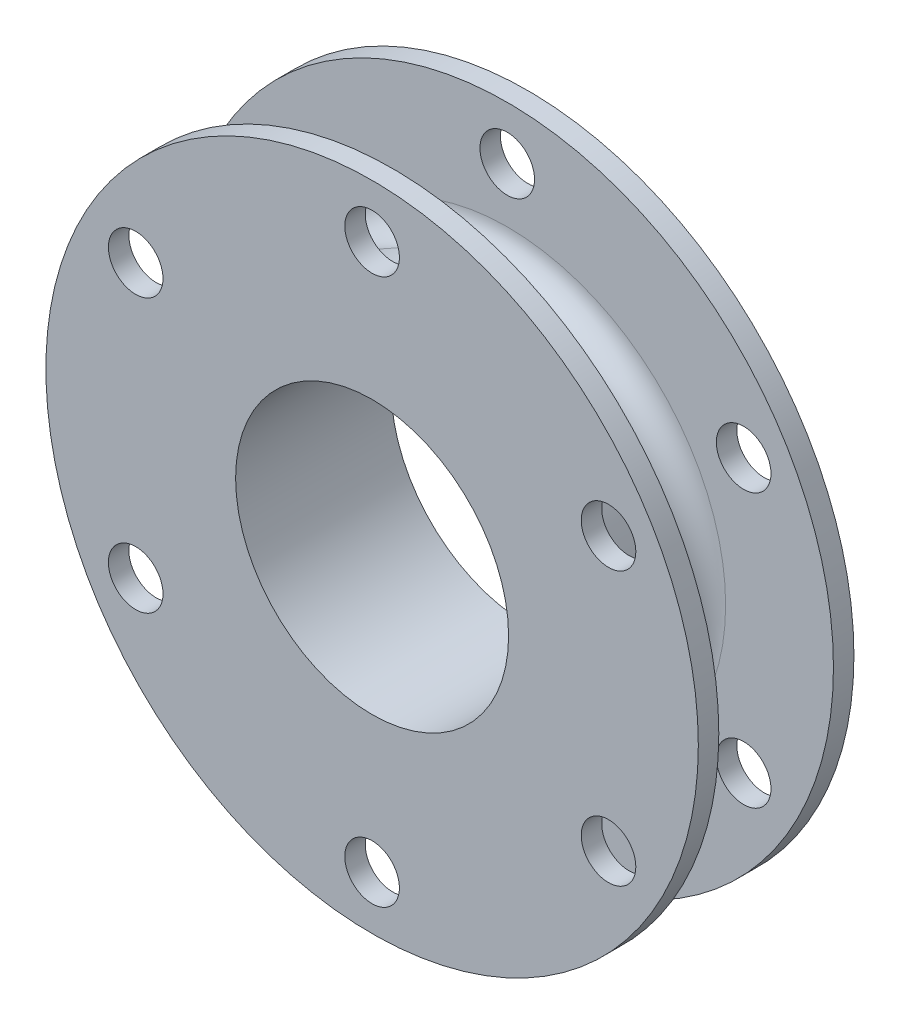
ISO-10303-21;
HEADER;
FILE_DESCRIPTION(('STEP AP214'),'2;1');
FILE_NAME('part.step','',(''),(''),'','','');
FILE_SCHEMA(('AUTOMOTIVE_DESIGN { 1 0 10303 214 1 1 1 1 }'));
ENDSEC;
DATA;
#1=APPLICATION_CONTEXT('core data for automotive mechanical design processes');
#2=APPLICATION_PROTOCOL_DEFINITION('international standard','automotive_design',2000,#1);
#3=PRODUCT_CONTEXT('',#1,'mechanical');
#4=PRODUCT('Part','Part','',(#3));
#5=PRODUCT_RELATED_PRODUCT_CATEGORY('part','',(#4));
#6=PRODUCT_DEFINITION_FORMATION('','',#4);
#7=PRODUCT_DEFINITION_CONTEXT('part definition',#1,'design');
#8=PRODUCT_DEFINITION('design','',#6,#7);
#9=PRODUCT_DEFINITION_SHAPE('','',#8);
#10=(LENGTH_UNIT() NAMED_UNIT(*) SI_UNIT(.MILLI.,.METRE.));
#11=(NAMED_UNIT(*) PLANE_ANGLE_UNIT() SI_UNIT($,.RADIAN.));
#12=(NAMED_UNIT(*) SI_UNIT($,.STERADIAN.) SOLID_ANGLE_UNIT());
#13=UNCERTAINTY_MEASURE_WITH_UNIT(LENGTH_MEASURE(1.E-05),#10,'distance_accuracy_value','');
#14=(GEOMETRIC_REPRESENTATION_CONTEXT(3) GLOBAL_UNCERTAINTY_ASSIGNED_CONTEXT((#13)) GLOBAL_UNIT_ASSIGNED_CONTEXT((#10,
#11,#12)) REPRESENTATION_CONTEXT('',''));
#15=CARTESIAN_POINT('',(0.,0.,0.));
#16=DIRECTION('',(0.,0.,1.));
#17=DIRECTION('',(1.,0.,0.));
#18=AXIS2_PLACEMENT_3D('',#15,#16,#17);
#19=CARTESIAN_POINT('',(0.,0.,50.9979797464467));
#20=DIRECTION('',(0.,0.,-1.));
#21=DIRECTION('',(-1.,0.,0.));
#22=AXIS2_PLACEMENT_3D('',#19,#20,#21);
#23=CYLINDRICAL_SURFACE('',#22,14.);
#24=CARTESIAN_POINT('',(0.,0.,7.9));
#25=DIRECTION('',(0.,0.,1.));
#26=DIRECTION('',(1.,0.,0.));
#27=AXIS2_PLACEMENT_3D('',#24,#25,#26);
#28=CIRCLE('',#27,14.);
#29=CARTESIAN_POINT('',(14.,0.,7.9));
#30=VERTEX_POINT('',#29);
#31=EDGE_CURVE('E49',#30,#30,#28,.F.);
#32=ORIENTED_EDGE('',*,*,#31,.T.);
#33=EDGE_LOOP('',(#32));
#34=FACE_BOUND('',#33,.T.);
#35=CARTESIAN_POINT('',(0.,0.,3.5));
#36=DIRECTION('',(0.,0.,1.));
#37=DIRECTION('',(1.,0.,0.));
#38=AXIS2_PLACEMENT_3D('',#35,#36,#37);
#39=CIRCLE('',#38,14.);
#40=CARTESIAN_POINT('',(14.,0.,3.5));
#41=VERTEX_POINT('',#40);
#42=EDGE_CURVE('E54',#41,#41,#39,.T.);
#43=ORIENTED_EDGE('',*,*,#42,.T.);
#44=EDGE_LOOP('',(#43));
#45=FACE_BOUND('',#44,.T.);
#46=ADVANCED_FACE('F41',(#34,#45),#23,.T.);
#47=CARTESIAN_POINT('',(0.,0.,1.5));
#48=DIRECTION('',(0.,0.,1.));
#49=DIRECTION('',(1.,0.,0.));
#50=AXIS2_PLACEMENT_3D('',#47,#48,#49);
#51=PLANE('',#50);
#52=CARTESIAN_POINT('',(0.,0.,1.5));
#53=DIRECTION('',(0.,0.,1.));
#54=DIRECTION('',(1.,0.,0.));
#55=AXIS2_PLACEMENT_3D('',#52,#53,#54);
#56=CIRCLE('',#55,16.);
#57=CARTESIAN_POINT('',(16.,0.,1.5));
#58=VERTEX_POINT('',#57);
#59=EDGE_CURVE('E10',#58,#58,#56,.F.);
#60=ORIENTED_EDGE('',*,*,#59,.T.);
#61=EDGE_LOOP('',(#60));
#62=FACE_BOUND('',#61,.T.);
#63=CARTESIAN_POINT('',(17.3205080756852,9.99999999999888,1.5));
#64=DIRECTION('',(0.,0.,1.));
#65=DIRECTION('',(1.,0.,0.));
#66=AXIS2_PLACEMENT_3D('',#63,#64,#65);
#67=CIRCLE('',#66,2.00000000000001);
#68=CARTESIAN_POINT('',(19.3205080756852,9.99999999999888,1.5));
#69=VERTEX_POINT('',#68);
#70=EDGE_CURVE('E102',#69,#69,#67,.T.);
#71=ORIENTED_EDGE('',*,*,#70,.F.);
#72=EDGE_LOOP('',(#71));
#73=FACE_BOUND('',#72,.T.);
#74=CARTESIAN_POINT('',(-17.3205080756924,9.99999999999049,1.5));
#75=DIRECTION('',(0.,0.,1.));
#76=DIRECTION('',(1.,0.,0.));
#77=AXIS2_PLACEMENT_3D('',#74,#75,#76);
#78=CIRCLE('',#77,2.);
#79=CARTESIAN_POINT('',(-15.3205080756924,9.99999999999049,1.5));
#80=VERTEX_POINT('',#79);
#81=EDGE_CURVE('E86',#80,#80,#78,.T.);
#82=ORIENTED_EDGE('',*,*,#81,.F.);
#83=EDGE_LOOP('',(#82));
#84=FACE_BOUND('',#83,.T.);
#85=CARTESIAN_POINT('',(2.32298736313842E-12,-20.,1.5));
#86=DIRECTION('',(0.,0.,1.));
#87=DIRECTION('',(1.,0.,0.));
#88=AXIS2_PLACEMENT_3D('',#85,#86,#87);
#89=CIRCLE('',#88,2.);
#90=CARTESIAN_POINT('',(2.00000000000232,-20.,1.5));
#91=VERTEX_POINT('',#90);
#92=EDGE_CURVE('E70',#91,#91,#89,.T.);
#93=ORIENTED_EDGE('',*,*,#92,.F.);
#94=EDGE_LOOP('',(#93));
#95=FACE_BOUND('',#94,.T.);
#96=CARTESIAN_POINT('',(0.,0.,1.5));
#97=DIRECTION('',(0.,0.,1.));
#98=DIRECTION('',(1.,0.,0.));
#99=AXIS2_PLACEMENT_3D('',#96,#97,#98);
#100=CIRCLE('',#99,23.9);
#101=CARTESIAN_POINT('',(23.9,0.,1.5));
#102=VERTEX_POINT('',#101);
#103=EDGE_CURVE('E65',#102,#102,#100,.T.);
#104=ORIENTED_EDGE('',*,*,#103,.T.);
#105=EDGE_LOOP('',(#104));
#106=FACE_BOUND('',#105,.T.);
#107=CARTESIAN_POINT('',(-17.3205080756875,-10.0000000000095,1.5));
#108=DIRECTION('',(0.,0.,1.));
#109=DIRECTION('',(1.,0.,0.));
#110=AXIS2_PLACEMENT_3D('',#107,#108,#109);
#111=CIRCLE('',#110,2.00000000000001);
#112=CARTESIAN_POINT('',(-15.3205080756875,-10.0000000000095,1.5));
#113=VERTEX_POINT('',#112);
#114=EDGE_CURVE('E78',#113,#113,#111,.T.);
#115=ORIENTED_EDGE('',*,*,#114,.F.);
#116=EDGE_LOOP('',(#115));
#117=FACE_BOUND('',#116,.T.);
#118=CARTESIAN_POINT('',(17.32050807569,-10.0000000000011,1.5));
#119=DIRECTION('',(0.,0.,1.));
#120=DIRECTION('',(1.,0.,0.));
#121=AXIS2_PLACEMENT_3D('',#118,#119,#120);
#122=CIRCLE('',#121,2.);
#123=CARTESIAN_POINT('',(19.32050807569,-10.0000000000011,1.5));
#124=VERTEX_POINT('',#123);
#125=EDGE_CURVE('E94',#124,#124,#122,.T.);
#126=ORIENTED_EDGE('',*,*,#125,.F.);
#127=EDGE_LOOP('',(#126));
#128=FACE_BOUND('',#127,.T.);
#129=CARTESIAN_POINT('',(0.,20.,1.5));
#130=DIRECTION('',(0.,0.,1.));
#131=DIRECTION('',(1.,0.,0.));
#132=AXIS2_PLACEMENT_3D('',#129,#130,#131);
#133=CIRCLE('',#132,2.);
#134=CARTESIAN_POINT('',(2.,20.,1.5));
#135=VERTEX_POINT('',#134);
#136=EDGE_CURVE('E110',#135,#135,#133,.T.);
#137=ORIENTED_EDGE('',*,*,#136,.F.);
#138=EDGE_LOOP('',(#137));
#139=FACE_BOUND('',#138,.T.);
#140=ADVANCED_FACE('F226',(#62,#73,#84,#95,#106,#117,#128,#139),#51,.T.);
#141=CARTESIAN_POINT('',(0.,0.,0.));
#142=DIRECTION('',(0.,0.,1.));
#143=DIRECTION('',(1.,0.,0.));
#144=AXIS2_PLACEMENT_3D('',#141,#142,#143);
#145=PLANE('',#144);
#146=CARTESIAN_POINT('',(0.,0.,0.));
#147=DIRECTION('',(0.,0.,1.));
#148=DIRECTION('',(1.,0.,0.));
#149=AXIS2_PLACEMENT_3D('',#146,#147,#148);
#150=CIRCLE('',#149,23.9);
#151=CARTESIAN_POINT('',(23.9,0.,0.));
#152=VERTEX_POINT('',#151);
#153=EDGE_CURVE('E66',#152,#152,#150,.T.);
#154=ORIENTED_EDGE('',*,*,#153,.F.);
#155=EDGE_LOOP('',(#154));
#156=FACE_BOUND('',#155,.T.);
#157=CARTESIAN_POINT('',(2.32298736313842E-12,-20.,0.));
#158=DIRECTION('',(0.,0.,1.));
#159=DIRECTION('',(1.,0.,0.));
#160=AXIS2_PLACEMENT_3D('',#157,#158,#159);
#161=CIRCLE('',#160,2.);
#162=CARTESIAN_POINT('',(2.00000000000232,-20.,0.));
#163=VERTEX_POINT('',#162);
#164=EDGE_CURVE('E74',#163,#163,#161,.T.);
#165=ORIENTED_EDGE('',*,*,#164,.T.);
#166=EDGE_LOOP('',(#165));
#167=FACE_BOUND('',#166,.T.);
#168=CARTESIAN_POINT('',(-17.3205080756875,-10.0000000000095,0.));
#169=DIRECTION('',(0.,0.,1.));
#170=DIRECTION('',(1.,0.,0.));
#171=AXIS2_PLACEMENT_3D('',#168,#169,#170);
#172=CIRCLE('',#171,2.00000000000001);
#173=CARTESIAN_POINT('',(-15.3205080756875,-10.0000000000095,0.));
#174=VERTEX_POINT('',#173);
#175=EDGE_CURVE('E82',#174,#174,#172,.T.);
#176=ORIENTED_EDGE('',*,*,#175,.T.);
#177=EDGE_LOOP('',(#176));
#178=FACE_BOUND('',#177,.T.);
#179=CARTESIAN_POINT('',(-17.3205080756924,9.99999999999049,0.));
#180=DIRECTION('',(0.,0.,1.));
#181=DIRECTION('',(1.,0.,0.));
#182=AXIS2_PLACEMENT_3D('',#179,#180,#181);
#183=CIRCLE('',#182,2.);
#184=CARTESIAN_POINT('',(-15.3205080756924,9.99999999999049,0.));
#185=VERTEX_POINT('',#184);
#186=EDGE_CURVE('E90',#185,#185,#183,.T.);
#187=ORIENTED_EDGE('',*,*,#186,.T.);
#188=EDGE_LOOP('',(#187));
#189=FACE_BOUND('',#188,.T.);
#190=CARTESIAN_POINT('',(17.32050807569,-10.0000000000011,0.));
#191=DIRECTION('',(0.,0.,1.));
#192=DIRECTION('',(1.,0.,0.));
#193=AXIS2_PLACEMENT_3D('',#190,#191,#192);
#194=CIRCLE('',#193,2.);
#195=CARTESIAN_POINT('',(19.32050807569,-10.0000000000011,0.));
#196=VERTEX_POINT('',#195);
#197=EDGE_CURVE('E98',#196,#196,#194,.T.);
#198=ORIENTED_EDGE('',*,*,#197,.T.);
#199=EDGE_LOOP('',(#198));
#200=FACE_BOUND('',#199,.T.);
#201=CARTESIAN_POINT('',(17.3205080756852,9.99999999999888,0.));
#202=DIRECTION('',(0.,0.,1.));
#203=DIRECTION('',(1.,0.,0.));
#204=AXIS2_PLACEMENT_3D('',#201,#202,#203);
#205=CIRCLE('',#204,2.00000000000001);
#206=CARTESIAN_POINT('',(19.3205080756852,9.99999999999888,0.));
#207=VERTEX_POINT('',#206);
#208=EDGE_CURVE('E106',#207,#207,#205,.T.);
#209=ORIENTED_EDGE('',*,*,#208,.T.);
#210=EDGE_LOOP('',(#209));
#211=FACE_BOUND('',#210,.T.);
#212=CARTESIAN_POINT('',(0.,20.,0.));
#213=DIRECTION('',(0.,0.,1.));
#214=DIRECTION('',(1.,0.,0.));
#215=AXIS2_PLACEMENT_3D('',#212,#213,#214);
#216=CIRCLE('',#215,2.);
#217=CARTESIAN_POINT('',(2.,20.,0.));
#218=VERTEX_POINT('',#217);
#219=EDGE_CURVE('E114',#218,#218,#216,.T.);
#220=ORIENTED_EDGE('',*,*,#219,.T.);
#221=EDGE_LOOP('',(#220));
#222=FACE_BOUND('',#221,.T.);
#223=CARTESIAN_POINT('',(0.,0.,0.));
#224=DIRECTION('',(0.,0.,1.));
#225=DIRECTION('',(1.,0.,0.));
#226=AXIS2_PLACEMENT_3D('',#223,#224,#225);
#227=CIRCLE('',#226,10.);
#228=CARTESIAN_POINT('',(10.,0.,0.));
#229=VERTEX_POINT('',#228);
#230=EDGE_CURVE('E118',#229,#229,#227,.T.);
#231=ORIENTED_EDGE('',*,*,#230,.T.);
#232=EDGE_LOOP('',(#231));
#233=FACE_BOUND('',#232,.T.);
#234=ADVANCED_FACE('F231',(#156,#167,#178,#189,#200,#211,#222,#233),#145,.F.);
#235=CARTESIAN_POINT('',(0.,0.,1.5));
#236=DIRECTION('',(0.,0.,-1.));
#237=DIRECTION('',(-1.,0.,0.));
#238=AXIS2_PLACEMENT_3D('',#235,#236,#237);
#239=CYLINDRICAL_SURFACE('',#238,23.9);
#240=ORIENTED_EDGE('',*,*,#103,.F.);
#241=EDGE_LOOP('',(#240));
#242=FACE_BOUND('',#241,.T.);
#243=ORIENTED_EDGE('',*,*,#153,.T.);
#244=EDGE_LOOP('',(#243));
#245=FACE_BOUND('',#244,.T.);
#246=ADVANCED_FACE('F260',(#242,#245),#239,.T.);
#247=CARTESIAN_POINT('',(2.32298736313842E-12,-20.,1.5));
#248=DIRECTION('',(0.,0.,-1.));
#249=DIRECTION('',(-1.,0.,0.));
#250=AXIS2_PLACEMENT_3D('',#247,#248,#249);
#251=CYLINDRICAL_SURFACE('',#250,2.);
#252=ORIENTED_EDGE('',*,*,#92,.T.);
#253=EDGE_LOOP('',(#252));
#254=FACE_BOUND('',#253,.T.);
#255=ORIENTED_EDGE('',*,*,#164,.F.);
#256=EDGE_LOOP('',(#255));
#257=FACE_BOUND('',#256,.T.);
#258=ADVANCED_FACE('F257',(#254,#257),#251,.F.);
#259=CARTESIAN_POINT('',(-17.3205080756875,-10.0000000000095,1.5));
#260=DIRECTION('',(0.,0.,-1.));
#261=DIRECTION('',(-1.,0.,0.));
#262=AXIS2_PLACEMENT_3D('',#259,#260,#261);
#263=CYLINDRICAL_SURFACE('',#262,2.00000000000001);
#264=ORIENTED_EDGE('',*,*,#114,.T.);
#265=EDGE_LOOP('',(#264));
#266=FACE_BOUND('',#265,.T.);
#267=ORIENTED_EDGE('',*,*,#175,.F.);
#268=EDGE_LOOP('',(#267));
#269=FACE_BOUND('',#268,.T.);
#270=ADVANCED_FACE('F253',(#266,#269),#263,.F.);
#271=CARTESIAN_POINT('',(-17.3205080756924,9.99999999999049,1.5));
#272=DIRECTION('',(0.,0.,-1.));
#273=DIRECTION('',(-1.,0.,0.));
#274=AXIS2_PLACEMENT_3D('',#271,#272,#273);
#275=CYLINDRICAL_SURFACE('',#274,2.);
#276=ORIENTED_EDGE('',*,*,#81,.T.);
#277=EDGE_LOOP('',(#276));
#278=FACE_BOUND('',#277,.T.);
#279=ORIENTED_EDGE('',*,*,#186,.F.);
#280=EDGE_LOOP('',(#279));
#281=FACE_BOUND('',#280,.T.);
#282=ADVANCED_FACE('F249',(#278,#281),#275,.F.);
#283=CARTESIAN_POINT('',(17.32050807569,-10.0000000000011,1.5));
#284=DIRECTION('',(0.,0.,-1.));
#285=DIRECTION('',(-1.,0.,0.));
#286=AXIS2_PLACEMENT_3D('',#283,#284,#285);
#287=CYLINDRICAL_SURFACE('',#286,2.);
#288=ORIENTED_EDGE('',*,*,#125,.T.);
#289=EDGE_LOOP('',(#288));
#290=FACE_BOUND('',#289,.T.);
#291=ORIENTED_EDGE('',*,*,#197,.F.);
#292=EDGE_LOOP('',(#291));
#293=FACE_BOUND('',#292,.T.);
#294=ADVANCED_FACE('F245',(#290,#293),#287,.F.);
#295=CARTESIAN_POINT('',(17.3205080756852,9.99999999999888,1.5));
#296=DIRECTION('',(0.,0.,-1.));
#297=DIRECTION('',(-1.,0.,0.));
#298=AXIS2_PLACEMENT_3D('',#295,#296,#297);
#299=CYLINDRICAL_SURFACE('',#298,2.00000000000001);
#300=ORIENTED_EDGE('',*,*,#70,.T.);
#301=EDGE_LOOP('',(#300));
#302=FACE_BOUND('',#301,.T.);
#303=ORIENTED_EDGE('',*,*,#208,.F.);
#304=EDGE_LOOP('',(#303));
#305=FACE_BOUND('',#304,.T.);
#306=ADVANCED_FACE('F241',(#302,#305),#299,.F.);
#307=CARTESIAN_POINT('',(0.,20.,1.5));
#308=DIRECTION('',(0.,0.,-1.));
#309=DIRECTION('',(-1.,0.,0.));
#310=AXIS2_PLACEMENT_3D('',#307,#308,#309);
#311=CYLINDRICAL_SURFACE('',#310,2.);
#312=ORIENTED_EDGE('',*,*,#136,.T.);
#313=EDGE_LOOP('',(#312));
#314=FACE_BOUND('',#313,.T.);
#315=ORIENTED_EDGE('',*,*,#219,.F.);
#316=EDGE_LOOP('',(#315));
#317=FACE_BOUND('',#316,.T.);
#318=ADVANCED_FACE('F237',(#314,#317),#311,.F.);
#319=CARTESIAN_POINT('',(0.,0.,1.5));
#320=DIRECTION('',(0.,0.,-1.));
#321=DIRECTION('',(-1.,0.,0.));
#322=AXIS2_PLACEMENT_3D('',#319,#320,#321);
#323=CYLINDRICAL_SURFACE('',#322,10.);
#324=CARTESIAN_POINT('',(0.,0.,11.4));
#325=DIRECTION('',(0.,0.,1.));
#326=DIRECTION('',(1.,0.,0.));
#327=AXIS2_PLACEMENT_3D('',#324,#325,#326);
#328=CIRCLE('',#327,10.);
#329=CARTESIAN_POINT('',(10.,0.,11.4));
#330=VERTEX_POINT('',#329);
#331=EDGE_CURVE('E125',#330,#330,#328,.T.);
#332=ORIENTED_EDGE('',*,*,#331,.T.);
#333=EDGE_LOOP('',(#332));
#334=FACE_BOUND('',#333,.T.);
#335=ORIENTED_EDGE('',*,*,#230,.F.);
#336=EDGE_LOOP('',(#335));
#337=FACE_BOUND('',#336,.T.);
#338=ADVANCED_FACE('F201',(#334,#337),#323,.F.);
#339=CARTESIAN_POINT('',(-5.98230232712327E-12,-5.32907051820075E-12,11.4));
#340=DIRECTION('',(0.,0.,1.));
#341=DIRECTION('',(0.,-1.,0.));
#342=AXIS2_PLACEMENT_3D('',#339,#340,#341);
#343=PLANE('',#342);
#344=ORIENTED_EDGE('',*,*,#331,.F.);
#345=EDGE_LOOP('',(#344));
#346=FACE_BOUND('',#345,.T.);
#347=CARTESIAN_POINT('',(-17.3205080756924,9.99999999999049,11.4));
#348=DIRECTION('',(0.,0.,1.));
#349=DIRECTION('',(1.,0.,0.));
#350=AXIS2_PLACEMENT_3D('',#347,#348,#349);
#351=CIRCLE('',#350,2.);
#352=CARTESIAN_POINT('',(-15.3205080756924,9.99999999999049,11.4));
#353=VERTEX_POINT('',#352);
#354=EDGE_CURVE('E178',#353,#353,#351,.T.);
#355=ORIENTED_EDGE('',*,*,#354,.F.);
#356=EDGE_LOOP('',(#355));
#357=FACE_BOUND('',#356,.T.);
#358=CARTESIAN_POINT('',(0.,20.,11.4));
#359=DIRECTION('',(0.,0.,1.));
#360=DIRECTION('',(1.,0.,0.));
#361=AXIS2_PLACEMENT_3D('',#358,#359,#360);
#362=CIRCLE('',#361,2.);
#363=CARTESIAN_POINT('',(2.,20.,11.4));
#364=VERTEX_POINT('',#363);
#365=EDGE_CURVE('E170',#364,#364,#362,.T.);
#366=ORIENTED_EDGE('',*,*,#365,.F.);
#367=EDGE_LOOP('',(#366));
#368=FACE_BOUND('',#367,.T.);
#369=CARTESIAN_POINT('',(17.3205080756852,9.99999999999888,11.4));
#370=DIRECTION('',(0.,0.,1.));
#371=DIRECTION('',(1.,0.,0.));
#372=AXIS2_PLACEMENT_3D('',#369,#370,#371);
#373=CIRCLE('',#372,2.00000000000001);
#374=CARTESIAN_POINT('',(19.3205080756852,9.99999999999888,11.4));
#375=VERTEX_POINT('',#374);
#376=EDGE_CURVE('E162',#375,#375,#373,.T.);
#377=ORIENTED_EDGE('',*,*,#376,.F.);
#378=EDGE_LOOP('',(#377));
#379=FACE_BOUND('',#378,.T.);
#380=CARTESIAN_POINT('',(17.32050807569,-10.0000000000011,11.4));
#381=DIRECTION('',(0.,0.,1.));
#382=DIRECTION('',(1.,0.,0.));
#383=AXIS2_PLACEMENT_3D('',#380,#381,#382);
#384=CIRCLE('',#383,2.);
#385=CARTESIAN_POINT('',(19.32050807569,-10.0000000000011,11.4));
#386=VERTEX_POINT('',#385);
#387=EDGE_CURVE('E154',#386,#386,#384,.T.);
#388=ORIENTED_EDGE('',*,*,#387,.F.);
#389=EDGE_LOOP('',(#388));
#390=FACE_BOUND('',#389,.T.);
#391=CARTESIAN_POINT('',(2.32298736313842E-12,-20.,11.4));
#392=DIRECTION('',(0.,0.,1.));
#393=DIRECTION('',(1.,0.,0.));
#394=AXIS2_PLACEMENT_3D('',#391,#392,#393);
#395=CIRCLE('',#394,2.);
#396=CARTESIAN_POINT('',(2.00000000000233,-20.,11.4));
#397=VERTEX_POINT('',#396);
#398=EDGE_CURVE('E146',#397,#397,#395,.T.);
#399=ORIENTED_EDGE('',*,*,#398,.F.);
#400=EDGE_LOOP('',(#399));
#401=FACE_BOUND('',#400,.T.);
#402=CARTESIAN_POINT('',(-17.3205080756875,-10.0000000000095,11.4));
#403=DIRECTION('',(0.,0.,1.));
#404=DIRECTION('',(1.,0.,0.));
#405=AXIS2_PLACEMENT_3D('',#402,#403,#404);
#406=CIRCLE('',#405,2.00000000000001);
#407=CARTESIAN_POINT('',(-15.3205080756875,-10.0000000000095,11.4));
#408=VERTEX_POINT('',#407);
#409=EDGE_CURVE('E138',#408,#408,#406,.T.);
#410=ORIENTED_EDGE('',*,*,#409,.F.);
#411=EDGE_LOOP('',(#410));
#412=FACE_BOUND('',#411,.T.);
#413=CARTESIAN_POINT('',(0.,0.,11.4));
#414=DIRECTION('',(0.,0.,1.));
#415=DIRECTION('',(1.,0.,0.));
#416=AXIS2_PLACEMENT_3D('',#413,#414,#415);
#417=CIRCLE('',#416,23.9);
#418=CARTESIAN_POINT('',(23.9,0.,11.4));
#419=VERTEX_POINT('',#418);
#420=EDGE_CURVE('E130',#419,#419,#417,.T.);
#421=ORIENTED_EDGE('',*,*,#420,.T.);
#422=EDGE_LOOP('',(#421));
#423=FACE_BOUND('',#422,.T.);
#424=ADVANCED_FACE('F197',(#346,#357,#368,#379,#390,#401,#412,#423),#343,.T.);
#425=CARTESIAN_POINT('',(0.,0.,9.9));
#426=DIRECTION('',(0.,0.,1.));
#427=DIRECTION('',(1.,0.,0.));
#428=AXIS2_PLACEMENT_3D('',#425,#426,#427);
#429=CYLINDRICAL_SURFACE('',#428,23.9);
#430=CARTESIAN_POINT('',(0.,0.,9.9));
#431=DIRECTION('',(0.,0.,1.));
#432=DIRECTION('',(1.,0.,0.));
#433=AXIS2_PLACEMENT_3D('',#430,#431,#432);
#434=CIRCLE('',#433,23.9);
#435=CARTESIAN_POINT('',(23.9,0.,9.9));
#436=VERTEX_POINT('',#435);
#437=EDGE_CURVE('E129',#436,#436,#434,.T.);
#438=ORIENTED_EDGE('',*,*,#437,.T.);
#439=EDGE_LOOP('',(#438));
#440=FACE_BOUND('',#439,.T.);
#441=ORIENTED_EDGE('',*,*,#420,.F.);
#442=EDGE_LOOP('',(#441));
#443=FACE_BOUND('',#442,.T.);
#444=ADVANCED_FACE('F200',(#440,#443),#429,.T.);
#445=CARTESIAN_POINT('',(0.,0.,9.9));
#446=DIRECTION('',(0.,0.,1.));
#447=DIRECTION('',(1.,0.,0.));
#448=AXIS2_PLACEMENT_3D('',#445,#446,#447);
#449=PLANE('',#448);
#450=CARTESIAN_POINT('',(0.,0.,9.9));
#451=DIRECTION('',(0.,0.,1.));
#452=DIRECTION('',(1.,0.,0.));
#453=AXIS2_PLACEMENT_3D('',#450,#451,#452);
#454=CIRCLE('',#453,16.);
#455=CARTESIAN_POINT('',(16.,0.,9.9));
#456=VERTEX_POINT('',#455);
#457=EDGE_CURVE('E59',#456,#456,#454,.T.);
#458=ORIENTED_EDGE('',*,*,#457,.T.);
#459=EDGE_LOOP('',(#458));
#460=FACE_BOUND('',#459,.T.);
#461=CARTESIAN_POINT('',(-17.3205080756924,9.99999999999049,9.9));
#462=DIRECTION('',(0.,0.,1.));
#463=DIRECTION('',(1.,0.,0.));
#464=AXIS2_PLACEMENT_3D('',#461,#462,#463);
#465=CIRCLE('',#464,2.);
#466=CARTESIAN_POINT('',(-15.3205080756924,9.99999999999049,9.9));
#467=VERTEX_POINT('',#466);
#468=EDGE_CURVE('E174',#467,#467,#465,.T.);
#469=ORIENTED_EDGE('',*,*,#468,.T.);
#470=EDGE_LOOP('',(#469));
#471=FACE_BOUND('',#470,.T.);
#472=CARTESIAN_POINT('',(0.,20.,9.9));
#473=DIRECTION('',(0.,0.,1.));
#474=DIRECTION('',(1.,0.,0.));
#475=AXIS2_PLACEMENT_3D('',#472,#473,#474);
#476=CIRCLE('',#475,2.);
#477=CARTESIAN_POINT('',(2.,20.,9.9));
#478=VERTEX_POINT('',#477);
#479=EDGE_CURVE('E166',#478,#478,#476,.T.);
#480=ORIENTED_EDGE('',*,*,#479,.T.);
#481=EDGE_LOOP('',(#480));
#482=FACE_BOUND('',#481,.T.);
#483=CARTESIAN_POINT('',(17.3205080756852,9.99999999999888,9.9));
#484=DIRECTION('',(0.,0.,1.));
#485=DIRECTION('',(1.,0.,0.));
#486=AXIS2_PLACEMENT_3D('',#483,#484,#485);
#487=CIRCLE('',#486,2.00000000000001);
#488=CARTESIAN_POINT('',(19.3205080756852,9.99999999999888,9.9));
#489=VERTEX_POINT('',#488);
#490=EDGE_CURVE('E158',#489,#489,#487,.T.);
#491=ORIENTED_EDGE('',*,*,#490,.T.);
#492=EDGE_LOOP('',(#491));
#493=FACE_BOUND('',#492,.T.);
#494=CARTESIAN_POINT('',(17.32050807569,-10.0000000000011,9.9));
#495=DIRECTION('',(0.,0.,1.));
#496=DIRECTION('',(1.,0.,0.));
#497=AXIS2_PLACEMENT_3D('',#494,#495,#496);
#498=CIRCLE('',#497,2.);
#499=CARTESIAN_POINT('',(19.32050807569,-10.0000000000011,9.9));
#500=VERTEX_POINT('',#499);
#501=EDGE_CURVE('E150',#500,#500,#498,.T.);
#502=ORIENTED_EDGE('',*,*,#501,.T.);
#503=EDGE_LOOP('',(#502));
#504=FACE_BOUND('',#503,.T.);
#505=CARTESIAN_POINT('',(2.32298736313842E-12,-20.,9.9));
#506=DIRECTION('',(0.,0.,1.));
#507=DIRECTION('',(1.,0.,0.));
#508=AXIS2_PLACEMENT_3D('',#505,#506,#507);
#509=CIRCLE('',#508,2.);
#510=CARTESIAN_POINT('',(2.00000000000233,-20.,9.9));
#511=VERTEX_POINT('',#510);
#512=EDGE_CURVE('E142',#511,#511,#509,.T.);
#513=ORIENTED_EDGE('',*,*,#512,.T.);
#514=EDGE_LOOP('',(#513));
#515=FACE_BOUND('',#514,.T.);
#516=CARTESIAN_POINT('',(-17.3205080756875,-10.0000000000095,9.9));
#517=DIRECTION('',(0.,0.,1.));
#518=DIRECTION('',(1.,0.,0.));
#519=AXIS2_PLACEMENT_3D('',#516,#517,#518);
#520=CIRCLE('',#519,2.00000000000001);
#521=CARTESIAN_POINT('',(-15.3205080756875,-10.0000000000095,9.9));
#522=VERTEX_POINT('',#521);
#523=EDGE_CURVE('E134',#522,#522,#520,.T.);
#524=ORIENTED_EDGE('',*,*,#523,.T.);
#525=EDGE_LOOP('',(#524));
#526=FACE_BOUND('',#525,.T.);
#527=ORIENTED_EDGE('',*,*,#437,.F.);
#528=EDGE_LOOP('',(#527));
#529=FACE_BOUND('',#528,.T.);
#530=ADVANCED_FACE('F186',(#460,#471,#482,#493,#504,#515,#526,#529),#449,.F.);
#531=CARTESIAN_POINT('',(-17.3205080756875,-10.0000000000095,9.9));
#532=DIRECTION('',(0.,0.,1.));
#533=DIRECTION('',(1.,0.,0.));
#534=AXIS2_PLACEMENT_3D('',#531,#532,#533);
#535=CYLINDRICAL_SURFACE('',#534,2.00000000000001);
#536=ORIENTED_EDGE('',*,*,#523,.F.);
#537=EDGE_LOOP('',(#536));
#538=FACE_BOUND('',#537,.T.);
#539=ORIENTED_EDGE('',*,*,#409,.T.);
#540=EDGE_LOOP('',(#539));
#541=FACE_BOUND('',#540,.T.);
#542=ADVANCED_FACE('F222',(#538,#541),#535,.F.);
#543=CARTESIAN_POINT('',(2.32298736313842E-12,-20.,9.9));
#544=DIRECTION('',(0.,0.,1.));
#545=DIRECTION('',(1.,0.,0.));
#546=AXIS2_PLACEMENT_3D('',#543,#544,#545);
#547=CYLINDRICAL_SURFACE('',#546,2.);
#548=ORIENTED_EDGE('',*,*,#512,.F.);
#549=EDGE_LOOP('',(#548));
#550=FACE_BOUND('',#549,.T.);
#551=ORIENTED_EDGE('',*,*,#398,.T.);
#552=EDGE_LOOP('',(#551));
#553=FACE_BOUND('',#552,.T.);
#554=ADVANCED_FACE('F347',(#550,#553),#547,.F.);
#555=CARTESIAN_POINT('',(17.32050807569,-10.0000000000011,9.9));
#556=DIRECTION('',(0.,0.,1.));
#557=DIRECTION('',(1.,0.,0.));
#558=AXIS2_PLACEMENT_3D('',#555,#556,#557);
#559=CYLINDRICAL_SURFACE('',#558,2.);
#560=ORIENTED_EDGE('',*,*,#501,.F.);
#561=EDGE_LOOP('',(#560));
#562=FACE_BOUND('',#561,.T.);
#563=ORIENTED_EDGE('',*,*,#387,.T.);
#564=EDGE_LOOP('',(#563));
#565=FACE_BOUND('',#564,.T.);
#566=ADVANCED_FACE('F336',(#562,#565),#559,.F.);
#567=CARTESIAN_POINT('',(17.3205080756852,9.99999999999888,9.9));
#568=DIRECTION('',(0.,0.,1.));
#569=DIRECTION('',(1.,0.,0.));
#570=AXIS2_PLACEMENT_3D('',#567,#568,#569);
#571=CYLINDRICAL_SURFACE('',#570,2.00000000000001);
#572=ORIENTED_EDGE('',*,*,#490,.F.);
#573=EDGE_LOOP('',(#572));
#574=FACE_BOUND('',#573,.T.);
#575=ORIENTED_EDGE('',*,*,#376,.T.);
#576=EDGE_LOOP('',(#575));
#577=FACE_BOUND('',#576,.T.);
#578=ADVANCED_FACE('F325',(#574,#577),#571,.F.);
#579=CARTESIAN_POINT('',(0.,20.,9.9));
#580=DIRECTION('',(0.,0.,1.));
#581=DIRECTION('',(1.,0.,0.));
#582=AXIS2_PLACEMENT_3D('',#579,#580,#581);
#583=CYLINDRICAL_SURFACE('',#582,2.);
#584=ORIENTED_EDGE('',*,*,#479,.F.);
#585=EDGE_LOOP('',(#584));
#586=FACE_BOUND('',#585,.T.);
#587=ORIENTED_EDGE('',*,*,#365,.T.);
#588=EDGE_LOOP('',(#587));
#589=FACE_BOUND('',#588,.T.);
#590=ADVANCED_FACE('F193',(#586,#589),#583,.F.);
#591=CARTESIAN_POINT('',(-17.3205080756924,9.99999999999049,9.9));
#592=DIRECTION('',(0.,0.,1.));
#593=DIRECTION('',(1.,0.,0.));
#594=AXIS2_PLACEMENT_3D('',#591,#592,#593);
#595=CYLINDRICAL_SURFACE('',#594,2.);
#596=ORIENTED_EDGE('',*,*,#468,.F.);
#597=EDGE_LOOP('',(#596));
#598=FACE_BOUND('',#597,.T.);
#599=ORIENTED_EDGE('',*,*,#354,.T.);
#600=EDGE_LOOP('',(#599));
#601=FACE_BOUND('',#600,.T.);
#602=ADVANCED_FACE('F189',(#598,#601),#595,.F.);
#603=CARTESIAN_POINT('',(0.,0.,7.9));
#604=DIRECTION('',(0.,0.,1.));
#605=DIRECTION('',(1.,0.,0.));
#606=AXIS2_PLACEMENT_3D('',#603,#604,#605);
#607=TOROIDAL_SURFACE('',#606,16.,2.);
#608=ORIENTED_EDGE('',*,*,#31,.F.);
#609=EDGE_LOOP('',(#608));
#610=FACE_BOUND('',#609,.T.);
#611=ORIENTED_EDGE('',*,*,#457,.F.);
#612=EDGE_LOOP('',(#611));
#613=FACE_BOUND('',#612,.T.);
#614=ADVANCED_FACE('F192',(#610,#613),#607,.F.);
#615=CARTESIAN_POINT('',(0.,0.,3.5));
#616=DIRECTION('',(0.,0.,1.));
#617=DIRECTION('',(1.,0.,0.));
#618=AXIS2_PLACEMENT_3D('',#615,#616,#617);
#619=TOROIDAL_SURFACE('',#618,16.,2.);
#620=ORIENTED_EDGE('',*,*,#59,.F.);
#621=EDGE_LOOP('',(#620));
#622=FACE_BOUND('',#621,.T.);
#623=ORIENTED_EDGE('',*,*,#42,.F.);
#624=EDGE_LOOP('',(#623));
#625=FACE_BOUND('',#624,.T.);
#626=ADVANCED_FACE('F43',(#622,#625),#619,.F.);
#627=CLOSED_SHELL('',(#46,#140,#234,#246,#258,#270,#282,#294,#306,#318,#338,#424,#444,#530,#542,
#554,#566,#578,#590,#602,#614,#626));
#628=MANIFOLD_SOLID_BREP('B2',#627);
#629=ADVANCED_BREP_SHAPE_REPRESENTATION('',(#18,#628),#14);
#630=SHAPE_DEFINITION_REPRESENTATION(#9,#629);
ENDSEC;
END-ISO-10303-21;
